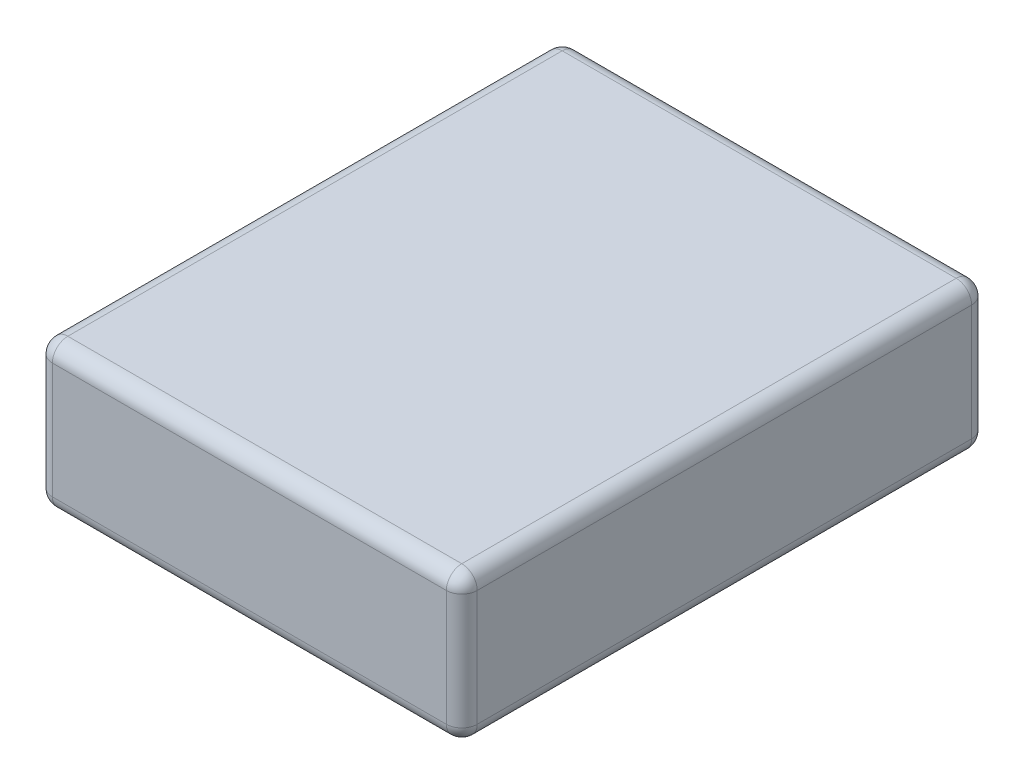
ISO-10303-21;
HEADER;
FILE_DESCRIPTION(('STEP AP214'),'2;1');
FILE_NAME('part.step','',(''),(''),'','','');
FILE_SCHEMA(('AUTOMOTIVE_DESIGN { 1 0 10303 214 1 1 1 1 }'));
ENDSEC;
DATA;
#1=APPLICATION_CONTEXT('core data for automotive mechanical design processes');
#2=APPLICATION_PROTOCOL_DEFINITION('international standard','automotive_design',2000,#1);
#3=PRODUCT_CONTEXT('',#1,'mechanical');
#4=PRODUCT('Part','Part','',(#3));
#5=PRODUCT_RELATED_PRODUCT_CATEGORY('part','',(#4));
#6=PRODUCT_DEFINITION_FORMATION('','',#4);
#7=PRODUCT_DEFINITION_CONTEXT('part definition',#1,'design');
#8=PRODUCT_DEFINITION('design','',#6,#7);
#9=PRODUCT_DEFINITION_SHAPE('','',#8);
#10=(LENGTH_UNIT() NAMED_UNIT(*) SI_UNIT(.MILLI.,.METRE.));
#11=(NAMED_UNIT(*) PLANE_ANGLE_UNIT() SI_UNIT($,.RADIAN.));
#12=(NAMED_UNIT(*) SI_UNIT($,.STERADIAN.) SOLID_ANGLE_UNIT());
#13=UNCERTAINTY_MEASURE_WITH_UNIT(LENGTH_MEASURE(1.E-05),#10,'distance_accuracy_value','');
#14=(GEOMETRIC_REPRESENTATION_CONTEXT(3) GLOBAL_UNCERTAINTY_ASSIGNED_CONTEXT((#13)) GLOBAL_UNIT_ASSIGNED_CONTEXT((#10,
#11,#12)) REPRESENTATION_CONTEXT('',''));
#15=CARTESIAN_POINT('',(0.,0.,0.));
#16=DIRECTION('',(0.,0.,1.));
#17=DIRECTION('',(1.,0.,0.));
#18=AXIS2_PLACEMENT_3D('',#15,#16,#17);
#19=CARTESIAN_POINT('',(-27.5,19.,34.));
#20=DIRECTION('',(1.,0.,0.));
#21=DIRECTION('',(0.,0.,-1.));
#22=AXIS2_PLACEMENT_3D('',#19,#20,#21);
#23=PLANE('',#22);
#24=DIRECTION('',(0.,-1.,0.));
#25=VECTOR('',#24,1.);
#26=CARTESIAN_POINT('',(-27.5,19.,32.));
#27=LINE('',#26,#25);
#28=CARTESIAN_POINT('',(-27.5,2.,32.));
#29=VERTEX_POINT('',#28);
#30=CARTESIAN_POINT('',(-27.5,17.,32.));
#31=VERTEX_POINT('',#30);
#32=EDGE_CURVE('E191',#29,#31,#27,.F.);
#33=ORIENTED_EDGE('',*,*,#32,.T.);
#34=DIRECTION('',(0.,0.,1.));
#35=VECTOR('',#34,1.);
#36=CARTESIAN_POINT('',(-27.5,17.,-34.));
#37=LINE('',#36,#35);
#38=CARTESIAN_POINT('',(-27.5,17.,-32.));
#39=VERTEX_POINT('',#38);
#40=EDGE_CURVE('E195',#31,#39,#37,.F.);
#41=ORIENTED_EDGE('',*,*,#40,.T.);
#42=DIRECTION('',(0.,-1.,0.));
#43=VECTOR('',#42,1.);
#44=CARTESIAN_POINT('',(-27.5,19.,-32.));
#45=LINE('',#44,#43);
#46=CARTESIAN_POINT('',(-27.5,2.,-32.));
#47=VERTEX_POINT('',#46);
#48=EDGE_CURVE('E188',#39,#47,#45,.T.);
#49=ORIENTED_EDGE('',*,*,#48,.T.);
#50=DIRECTION('',(0.,0.,1.));
#51=VECTOR('',#50,1.);
#52=CARTESIAN_POINT('',(-27.5,2.,34.));
#53=LINE('',#52,#51);
#54=EDGE_CURVE('E185',#47,#29,#53,.T.);
#55=ORIENTED_EDGE('',*,*,#54,.T.);
#56=EDGE_LOOP('',(#33,#41,#49,#55));
#57=FACE_BOUND('',#56,.T.);
#58=ADVANCED_FACE('F45',(#57),#23,.F.);
#59=CARTESIAN_POINT('',(27.5,19.,34.));
#60=DIRECTION('',(0.,0.,-1.));
#61=DIRECTION('',(-1.,0.,0.));
#62=AXIS2_PLACEMENT_3D('',#59,#60,#61);
#63=PLANE('',#62);
#64=DIRECTION('',(0.,-1.,0.));
#65=VECTOR('',#64,1.);
#66=CARTESIAN_POINT('',(-25.5,19.,34.));
#67=LINE('',#66,#65);
#68=CARTESIAN_POINT('',(-25.5,17.,34.));
#69=VERTEX_POINT('',#68);
#70=CARTESIAN_POINT('',(-25.5,2.,34.));
#71=VERTEX_POINT('',#70);
#72=EDGE_CURVE('E147',#69,#71,#67,.T.);
#73=ORIENTED_EDGE('',*,*,#72,.T.);
#74=DIRECTION('',(1.,0.,0.));
#75=VECTOR('',#74,1.);
#76=CARTESIAN_POINT('',(27.5,2.,34.));
#77=LINE('',#76,#75);
#78=CARTESIAN_POINT('',(25.5,2.,34.));
#79=VERTEX_POINT('',#78);
#80=EDGE_CURVE('E142',#71,#79,#77,.T.);
#81=ORIENTED_EDGE('',*,*,#80,.T.);
#82=DIRECTION('',(0.,-1.,0.));
#83=VECTOR('',#82,1.);
#84=CARTESIAN_POINT('',(25.5,19.,34.));
#85=LINE('',#84,#83);
#86=CARTESIAN_POINT('',(25.5,17.,34.));
#87=VERTEX_POINT('',#86);
#88=EDGE_CURVE('E134',#79,#87,#85,.F.);
#89=ORIENTED_EDGE('',*,*,#88,.T.);
#90=DIRECTION('',(1.,0.,0.));
#91=VECTOR('',#90,1.);
#92=CARTESIAN_POINT('',(-27.5,17.,34.));
#93=LINE('',#92,#91);
#94=EDGE_CURVE('E139',#87,#69,#93,.F.);
#95=ORIENTED_EDGE('',*,*,#94,.T.);
#96=EDGE_LOOP('',(#73,#81,#89,#95));
#97=FACE_BOUND('',#96,.T.);
#98=ADVANCED_FACE('F137',(#97),#63,.F.);
#99=CARTESIAN_POINT('',(27.5,19.,34.));
#100=DIRECTION('',(-1.,0.,0.));
#101=DIRECTION('',(0.,0.,1.));
#102=AXIS2_PLACEMENT_3D('',#99,#100,#101);
#103=PLANE('',#102);
#104=DIRECTION('',(0.,-1.,0.));
#105=VECTOR('',#104,1.);
#106=CARTESIAN_POINT('',(27.5,19.,32.));
#107=LINE('',#106,#105);
#108=CARTESIAN_POINT('',(27.5,17.,32.));
#109=VERTEX_POINT('',#108);
#110=CARTESIAN_POINT('',(27.5,2.,32.));
#111=VERTEX_POINT('',#110);
#112=EDGE_CURVE('E155',#109,#111,#107,.T.);
#113=ORIENTED_EDGE('',*,*,#112,.T.);
#114=DIRECTION('',(0.,0.,-1.));
#115=VECTOR('',#114,1.);
#116=CARTESIAN_POINT('',(27.5,2.,34.));
#117=LINE('',#116,#115);
#118=CARTESIAN_POINT('',(27.5,2.,-32.));
#119=VERTEX_POINT('',#118);
#120=EDGE_CURVE('E206',#111,#119,#117,.T.);
#121=ORIENTED_EDGE('',*,*,#120,.T.);
#122=DIRECTION('',(0.,-1.,0.));
#123=VECTOR('',#122,1.);
#124=CARTESIAN_POINT('',(27.5,19.,-32.));
#125=LINE('',#124,#123);
#126=CARTESIAN_POINT('',(27.5,17.,-32.));
#127=VERTEX_POINT('',#126);
#128=EDGE_CURVE('E201',#119,#127,#125,.F.);
#129=ORIENTED_EDGE('',*,*,#128,.T.);
#130=DIRECTION('',(0.,0.,-1.));
#131=VECTOR('',#130,1.);
#132=CARTESIAN_POINT('',(27.5,17.,34.));
#133=LINE('',#132,#131);
#134=EDGE_CURVE('E198',#127,#109,#133,.F.);
#135=ORIENTED_EDGE('',*,*,#134,.T.);
#136=EDGE_LOOP('',(#113,#121,#129,#135));
#137=FACE_BOUND('',#136,.T.);
#138=ADVANCED_FACE('F368',(#137),#103,.F.);
#139=CARTESIAN_POINT('',(27.5,19.,-34.));
#140=DIRECTION('',(0.,0.,1.));
#141=DIRECTION('',(1.,0.,0.));
#142=AXIS2_PLACEMENT_3D('',#139,#140,#141);
#143=PLANE('',#142);
#144=DIRECTION('',(0.,-1.,0.));
#145=VECTOR('',#144,1.);
#146=CARTESIAN_POINT('',(25.5,19.,-34.));
#147=LINE('',#146,#145);
#148=CARTESIAN_POINT('',(25.5,17.,-34.));
#149=VERTEX_POINT('',#148);
#150=CARTESIAN_POINT('',(25.5,2.,-34.));
#151=VERTEX_POINT('',#150);
#152=EDGE_CURVE('E212',#149,#151,#147,.T.);
#153=ORIENTED_EDGE('',*,*,#152,.T.);
#154=DIRECTION('',(-1.,0.,0.));
#155=VECTOR('',#154,1.);
#156=CARTESIAN_POINT('',(27.5,2.,-34.));
#157=LINE('',#156,#155);
#158=CARTESIAN_POINT('',(-25.5,2.,-34.));
#159=VERTEX_POINT('',#158);
#160=EDGE_CURVE('E219',#151,#159,#157,.T.);
#161=ORIENTED_EDGE('',*,*,#160,.T.);
#162=DIRECTION('',(0.,-1.,0.));
#163=VECTOR('',#162,1.);
#164=CARTESIAN_POINT('',(-25.5,19.,-34.));
#165=LINE('',#164,#163);
#166=CARTESIAN_POINT('',(-25.5,17.,-34.));
#167=VERTEX_POINT('',#166);
#168=EDGE_CURVE('E215',#159,#167,#165,.F.);
#169=ORIENTED_EDGE('',*,*,#168,.T.);
#170=DIRECTION('',(-1.,0.,0.));
#171=VECTOR('',#170,1.);
#172=CARTESIAN_POINT('',(27.5,17.,-34.));
#173=LINE('',#172,#171);
#174=EDGE_CURVE('E209',#167,#149,#173,.F.);
#175=ORIENTED_EDGE('',*,*,#174,.T.);
#176=EDGE_LOOP('',(#153,#161,#169,#175));
#177=FACE_BOUND('',#176,.T.);
#178=ADVANCED_FACE('F352',(#177),#143,.F.);
#179=CARTESIAN_POINT('',(0.,19.,0.));
#180=DIRECTION('',(0.,1.,0.));
#181=DIRECTION('',(0.,0.,1.));
#182=AXIS2_PLACEMENT_3D('',#179,#180,#181);
#183=PLANE('',#182);
#184=DIRECTION('',(-1.,0.,0.));
#185=VECTOR('',#184,1.);
#186=CARTESIAN_POINT('',(-27.5,19.,-32.));
#187=LINE('',#186,#185);
#188=CARTESIAN_POINT('',(25.5,19.,-32.));
#189=VERTEX_POINT('',#188);
#190=CARTESIAN_POINT('',(-25.5,19.,-32.));
#191=VERTEX_POINT('',#190);
#192=EDGE_CURVE('E55',#189,#191,#187,.T.);
#193=ORIENTED_EDGE('',*,*,#192,.T.);
#194=DIRECTION('',(0.,0.,1.));
#195=VECTOR('',#194,1.);
#196=CARTESIAN_POINT('',(-25.5,19.,34.));
#197=LINE('',#196,#195);
#198=CARTESIAN_POINT('',(-25.5,19.,32.));
#199=VERTEX_POINT('',#198);
#200=EDGE_CURVE('E11',#191,#199,#197,.T.);
#201=ORIENTED_EDGE('',*,*,#200,.T.);
#202=DIRECTION('',(1.,0.,0.));
#203=VECTOR('',#202,1.);
#204=CARTESIAN_POINT('',(27.5,19.,32.));
#205=LINE('',#204,#203);
#206=CARTESIAN_POINT('',(25.5,19.,32.));
#207=VERTEX_POINT('',#206);
#208=EDGE_CURVE('E238',#199,#207,#205,.T.);
#209=ORIENTED_EDGE('',*,*,#208,.T.);
#210=DIRECTION('',(0.,0.,-1.));
#211=VECTOR('',#210,1.);
#212=CARTESIAN_POINT('',(25.5,19.,-34.));
#213=LINE('',#212,#211);
#214=EDGE_CURVE('E235',#207,#189,#213,.T.);
#215=ORIENTED_EDGE('',*,*,#214,.T.);
#216=EDGE_LOOP('',(#193,#201,#209,#215));
#217=FACE_BOUND('',#216,.T.);
#218=ADVANCED_FACE('F363',(#217),#183,.T.);
#219=CARTESIAN_POINT('',(0.,0.,0.));
#220=DIRECTION('',(0.,1.,0.));
#221=DIRECTION('',(0.,0.,1.));
#222=AXIS2_PLACEMENT_3D('',#219,#220,#221);
#223=PLANE('',#222);
#224=DIRECTION('',(1.,0.,0.));
#225=VECTOR('',#224,1.);
#226=CARTESIAN_POINT('',(0.,0.,32.));
#227=LINE('',#226,#225);
#228=CARTESIAN_POINT('',(25.5,0.,32.));
#229=VERTEX_POINT('',#228);
#230=CARTESIAN_POINT('',(-25.5,0.,32.));
#231=VERTEX_POINT('',#230);
#232=EDGE_CURVE('E225',#229,#231,#227,.F.);
#233=ORIENTED_EDGE('',*,*,#232,.T.);
#234=DIRECTION('',(0.,0.,1.));
#235=VECTOR('',#234,1.);
#236=CARTESIAN_POINT('',(-25.5,0.,0.));
#237=LINE('',#236,#235);
#238=CARTESIAN_POINT('',(-25.5,0.,-32.));
#239=VERTEX_POINT('',#238);
#240=EDGE_CURVE('E232',#231,#239,#237,.F.);
#241=ORIENTED_EDGE('',*,*,#240,.T.);
#242=DIRECTION('',(-1.,0.,0.));
#243=VECTOR('',#242,1.);
#244=CARTESIAN_POINT('',(0.,0.,-32.));
#245=LINE('',#244,#243);
#246=CARTESIAN_POINT('',(25.5,0.,-32.));
#247=VERTEX_POINT('',#246);
#248=EDGE_CURVE('E228',#239,#247,#245,.F.);
#249=ORIENTED_EDGE('',*,*,#248,.T.);
#250=DIRECTION('',(0.,0.,-1.));
#251=VECTOR('',#250,1.);
#252=CARTESIAN_POINT('',(25.5,0.,0.));
#253=LINE('',#252,#251);
#254=EDGE_CURVE('E222',#247,#229,#253,.F.);
#255=ORIENTED_EDGE('',*,*,#254,.T.);
#256=EDGE_LOOP('',(#233,#241,#249,#255));
#257=FACE_BOUND('',#256,.T.);
#258=ADVANCED_FACE('F326',(#257),#223,.F.);
#259=CARTESIAN_POINT('',(25.5,19.,-32.));
#260=DIRECTION('',(0.,-1.,0.));
#261=DIRECTION('',(0.,0.,-1.));
#262=AXIS2_PLACEMENT_3D('',#259,#260,#261);
#263=CYLINDRICAL_SURFACE('',#262,2.);
#264=CARTESIAN_POINT('',(25.5,17.,-32.));
#265=DIRECTION('',(0.,1.,0.));
#266=DIRECTION('',(0.,0.,1.));
#267=AXIS2_PLACEMENT_3D('',#264,#265,#266);
#268=CIRCLE('',#267,2.);
#269=EDGE_CURVE('E49',#127,#149,#268,.T.);
#270=ORIENTED_EDGE('',*,*,#269,.F.);
#271=ORIENTED_EDGE('',*,*,#128,.F.);
#272=CARTESIAN_POINT('',(25.5,2.,-32.));
#273=DIRECTION('',(0.,-1.,0.));
#274=DIRECTION('',(0.,0.,-1.));
#275=AXIS2_PLACEMENT_3D('',#272,#273,#274);
#276=CIRCLE('',#275,2.);
#277=EDGE_CURVE('E179',#151,#119,#276,.T.);
#278=ORIENTED_EDGE('',*,*,#277,.F.);
#279=ORIENTED_EDGE('',*,*,#152,.F.);
#280=EDGE_LOOP('',(#270,#271,#278,#279));
#281=FACE_BOUND('',#280,.T.);
#282=ADVANCED_FACE('F47',(#281),#263,.T.);
#283=CARTESIAN_POINT('',(25.5,17.,-32.));
#284=DIRECTION('',(0.,0.,-1.));
#285=DIRECTION('',(-1.,0.,0.));
#286=AXIS2_PLACEMENT_3D('',#283,#284,#285);
#287=SPHERICAL_SURFACE('',#286,2.);
#288=CARTESIAN_POINT('',(25.5,17.,-32.));
#289=DIRECTION('',(0.,0.,-1.));
#290=DIRECTION('',(-1.,0.,0.));
#291=AXIS2_PLACEMENT_3D('',#288,#289,#290);
#292=CIRCLE('',#291,2.);
#293=EDGE_CURVE('E302',#127,#189,#292,.F.);
#294=ORIENTED_EDGE('',*,*,#293,.F.);
#295=ORIENTED_EDGE('',*,*,#269,.T.);
#296=CARTESIAN_POINT('',(25.5,17.,-32.));
#297=DIRECTION('',(1.,0.,0.));
#298=DIRECTION('',(0.,0.,-1.));
#299=AXIS2_PLACEMENT_3D('',#296,#297,#298);
#300=CIRCLE('',#299,2.);
#301=EDGE_CURVE('E306',#189,#149,#300,.F.);
#302=ORIENTED_EDGE('',*,*,#301,.F.);
#303=EDGE_LOOP('',(#294,#295,#302));
#304=FACE_BOUND('',#303,.T.);
#305=ADVANCED_FACE('F357',(#304),#287,.T.);
#306=CARTESIAN_POINT('',(25.5,2.,-32.));
#307=DIRECTION('',(1.,0.,0.));
#308=DIRECTION('',(0.,1.,0.));
#309=AXIS2_PLACEMENT_3D('',#306,#307,#308);
#310=SPHERICAL_SURFACE('',#309,2.);
#311=CARTESIAN_POINT('',(25.5,2.,-32.));
#312=DIRECTION('',(1.,0.,0.));
#313=DIRECTION('',(0.,0.,-1.));
#314=AXIS2_PLACEMENT_3D('',#311,#312,#313);
#315=CIRCLE('',#314,2.);
#316=EDGE_CURVE('E294',#151,#247,#315,.F.);
#317=ORIENTED_EDGE('',*,*,#316,.F.);
#318=ORIENTED_EDGE('',*,*,#277,.T.);
#319=CARTESIAN_POINT('',(25.5,2.,-32.));
#320=DIRECTION('',(0.,0.,-1.));
#321=DIRECTION('',(-1.,0.,0.));
#322=AXIS2_PLACEMENT_3D('',#319,#320,#321);
#323=CIRCLE('',#322,2.);
#324=EDGE_CURVE('E298',#247,#119,#323,.F.);
#325=ORIENTED_EDGE('',*,*,#324,.F.);
#326=EDGE_LOOP('',(#317,#318,#325));
#327=FACE_BOUND('',#326,.T.);
#328=ADVANCED_FACE('F315',(#327),#310,.T.);
#329=CARTESIAN_POINT('',(0.,17.,-32.));
#330=DIRECTION('',(1.,0.,0.));
#331=DIRECTION('',(0.,0.,-1.));
#332=AXIS2_PLACEMENT_3D('',#329,#330,#331);
#333=CYLINDRICAL_SURFACE('',#332,2.);
#334=ORIENTED_EDGE('',*,*,#301,.T.);
#335=ORIENTED_EDGE('',*,*,#174,.F.);
#336=CARTESIAN_POINT('',(-25.5,17.,-32.));
#337=DIRECTION('',(-1.,0.,0.));
#338=DIRECTION('',(0.,0.,1.));
#339=AXIS2_PLACEMENT_3D('',#336,#337,#338);
#340=CIRCLE('',#339,2.);
#341=EDGE_CURVE('E287',#191,#167,#340,.T.);
#342=ORIENTED_EDGE('',*,*,#341,.F.);
#343=ORIENTED_EDGE('',*,*,#192,.F.);
#344=EDGE_LOOP('',(#334,#335,#342,#343));
#345=FACE_BOUND('',#344,.T.);
#346=ADVANCED_FACE('F361',(#345),#333,.T.);
#347=CARTESIAN_POINT('',(25.5,17.,0.));
#348=DIRECTION('',(0.,0.,1.));
#349=DIRECTION('',(1.,0.,0.));
#350=AXIS2_PLACEMENT_3D('',#347,#348,#349);
#351=CYLINDRICAL_SURFACE('',#350,2.);
#352=ORIENTED_EDGE('',*,*,#293,.T.);
#353=ORIENTED_EDGE('',*,*,#214,.F.);
#354=CARTESIAN_POINT('',(25.5,17.,32.));
#355=DIRECTION('',(0.,0.,1.));
#356=DIRECTION('',(1.,0.,0.));
#357=AXIS2_PLACEMENT_3D('',#354,#355,#356);
#358=CIRCLE('',#357,2.);
#359=EDGE_CURVE('E160',#109,#207,#358,.T.);
#360=ORIENTED_EDGE('',*,*,#359,.F.);
#361=ORIENTED_EDGE('',*,*,#134,.F.);
#362=EDGE_LOOP('',(#352,#353,#360,#361));
#363=FACE_BOUND('',#362,.T.);
#364=ADVANCED_FACE('F366',(#363),#351,.T.);
#365=CARTESIAN_POINT('',(25.5,19.,32.));
#366=DIRECTION('',(0.,-1.,0.));
#367=DIRECTION('',(0.,0.,-1.));
#368=AXIS2_PLACEMENT_3D('',#365,#366,#367);
#369=CYLINDRICAL_SURFACE('',#368,2.);
#370=CARTESIAN_POINT('',(25.5,2.,32.));
#371=DIRECTION('',(0.,-1.,0.));
#372=DIRECTION('',(0.,0.,-1.));
#373=AXIS2_PLACEMENT_3D('',#370,#371,#372);
#374=CIRCLE('',#373,2.);
#375=EDGE_CURVE('E161',#111,#79,#374,.T.);
#376=ORIENTED_EDGE('',*,*,#375,.F.);
#377=ORIENTED_EDGE('',*,*,#112,.F.);
#378=CARTESIAN_POINT('',(25.5,17.,32.));
#379=DIRECTION('',(0.,1.,0.));
#380=DIRECTION('',(0.,0.,1.));
#381=AXIS2_PLACEMENT_3D('',#378,#379,#380);
#382=CIRCLE('',#381,2.);
#383=EDGE_CURVE('E151',#87,#109,#382,.T.);
#384=ORIENTED_EDGE('',*,*,#383,.F.);
#385=ORIENTED_EDGE('',*,*,#88,.F.);
#386=EDGE_LOOP('',(#376,#377,#384,#385));
#387=FACE_BOUND('',#386,.T.);
#388=ADVANCED_FACE('F153',(#387),#369,.T.);
#389=CARTESIAN_POINT('',(25.5,2.,34.));
#390=DIRECTION('',(0.,0.,-1.));
#391=DIRECTION('',(-1.,0.,0.));
#392=AXIS2_PLACEMENT_3D('',#389,#390,#391);
#393=CYLINDRICAL_SURFACE('',#392,2.);
#394=ORIENTED_EDGE('',*,*,#324,.T.);
#395=ORIENTED_EDGE('',*,*,#120,.F.);
#396=CARTESIAN_POINT('',(25.5,2.,32.));
#397=DIRECTION('',(0.,0.,1.));
#398=DIRECTION('',(1.,0.,0.));
#399=AXIS2_PLACEMENT_3D('',#396,#397,#398);
#400=CIRCLE('',#399,2.);
#401=EDGE_CURVE('E280',#229,#111,#400,.T.);
#402=ORIENTED_EDGE('',*,*,#401,.F.);
#403=ORIENTED_EDGE('',*,*,#254,.F.);
#404=EDGE_LOOP('',(#394,#395,#402,#403));
#405=FACE_BOUND('',#404,.T.);
#406=ADVANCED_FACE('F322',(#405),#393,.T.);
#407=CARTESIAN_POINT('',(27.5,2.,-32.));
#408=DIRECTION('',(-1.,0.,0.));
#409=DIRECTION('',(0.,0.,1.));
#410=AXIS2_PLACEMENT_3D('',#407,#408,#409);
#411=CYLINDRICAL_SURFACE('',#410,2.);
#412=ORIENTED_EDGE('',*,*,#316,.T.);
#413=ORIENTED_EDGE('',*,*,#248,.F.);
#414=CARTESIAN_POINT('',(-25.5,2.,-32.));
#415=DIRECTION('',(-1.,0.,0.));
#416=DIRECTION('',(0.,0.,1.));
#417=AXIS2_PLACEMENT_3D('',#414,#415,#416);
#418=CIRCLE('',#417,2.);
#419=EDGE_CURVE('E276',#159,#239,#418,.T.);
#420=ORIENTED_EDGE('',*,*,#419,.F.);
#421=ORIENTED_EDGE('',*,*,#160,.F.);
#422=EDGE_LOOP('',(#412,#413,#420,#421));
#423=FACE_BOUND('',#422,.T.);
#424=ADVANCED_FACE('F332',(#423),#411,.T.);
#425=CARTESIAN_POINT('',(-25.5,19.,-32.));
#426=DIRECTION('',(0.,-1.,0.));
#427=DIRECTION('',(0.,0.,-1.));
#428=AXIS2_PLACEMENT_3D('',#425,#426,#427);
#429=CYLINDRICAL_SURFACE('',#428,2.);
#430=CARTESIAN_POINT('',(-25.5,17.,-32.));
#431=DIRECTION('',(0.,1.,0.));
#432=DIRECTION('',(0.,0.,1.));
#433=AXIS2_PLACEMENT_3D('',#430,#431,#432);
#434=CIRCLE('',#433,2.);
#435=EDGE_CURVE('E290',#167,#39,#434,.T.);
#436=ORIENTED_EDGE('',*,*,#435,.F.);
#437=ORIENTED_EDGE('',*,*,#168,.F.);
#438=CARTESIAN_POINT('',(-25.5,2.,-32.));
#439=DIRECTION('',(0.,-1.,0.));
#440=DIRECTION('',(0.,0.,-1.));
#441=AXIS2_PLACEMENT_3D('',#438,#439,#440);
#442=CIRCLE('',#441,2.);
#443=EDGE_CURVE('E272',#47,#159,#442,.T.);
#444=ORIENTED_EDGE('',*,*,#443,.F.);
#445=ORIENTED_EDGE('',*,*,#48,.F.);
#446=EDGE_LOOP('',(#436,#437,#444,#445));
#447=FACE_BOUND('',#446,.T.);
#448=ADVANCED_FACE('F349',(#447),#429,.T.);
#449=CARTESIAN_POINT('',(-25.5,17.,-32.));
#450=DIRECTION('',(0.,0.,-1.));
#451=DIRECTION('',(-1.,0.,0.));
#452=AXIS2_PLACEMENT_3D('',#449,#450,#451);
#453=SPHERICAL_SURFACE('',#452,2.);
#454=ORIENTED_EDGE('',*,*,#341,.T.);
#455=ORIENTED_EDGE('',*,*,#435,.T.);
#456=CARTESIAN_POINT('',(-25.5,17.,-32.));
#457=DIRECTION('',(0.,0.,-1.));
#458=DIRECTION('',(0.,1.,0.));
#459=AXIS2_PLACEMENT_3D('',#456,#457,#458);
#460=CIRCLE('',#459,2.);
#461=EDGE_CURVE('E168',#191,#39,#460,.F.);
#462=ORIENTED_EDGE('',*,*,#461,.F.);
#463=EDGE_LOOP('',(#454,#455,#462));
#464=FACE_BOUND('',#463,.T.);
#465=ADVANCED_FACE('F413',(#464),#453,.T.);
#466=CARTESIAN_POINT('',(25.5,17.,32.));
#467=DIRECTION('',(1.,0.,0.));
#468=DIRECTION('',(0.,0.,-1.));
#469=AXIS2_PLACEMENT_3D('',#466,#467,#468);
#470=SPHERICAL_SURFACE('',#469,2.);
#471=ORIENTED_EDGE('',*,*,#383,.T.);
#472=ORIENTED_EDGE('',*,*,#359,.T.);
#473=CARTESIAN_POINT('',(25.5,17.,32.));
#474=DIRECTION('',(1.,0.,0.));
#475=DIRECTION('',(0.,0.,-1.));
#476=AXIS2_PLACEMENT_3D('',#473,#474,#475);
#477=CIRCLE('',#476,2.);
#478=EDGE_CURVE('E164',#87,#207,#477,.F.);
#479=ORIENTED_EDGE('',*,*,#478,.F.);
#480=EDGE_LOOP('',(#471,#472,#479));
#481=FACE_BOUND('',#480,.T.);
#482=ADVANCED_FACE('F165',(#481),#470,.T.);
#483=CARTESIAN_POINT('',(25.5,2.,32.));
#484=DIRECTION('',(1.,0.,0.));
#485=DIRECTION('',(0.,1.,0.));
#486=AXIS2_PLACEMENT_3D('',#483,#484,#485);
#487=SPHERICAL_SURFACE('',#486,2.);
#488=ORIENTED_EDGE('',*,*,#401,.T.);
#489=ORIENTED_EDGE('',*,*,#375,.T.);
#490=CARTESIAN_POINT('',(25.5,2.,32.));
#491=DIRECTION('',(1.,0.,0.));
#492=DIRECTION('',(0.,0.,-1.));
#493=AXIS2_PLACEMENT_3D('',#490,#491,#492);
#494=CIRCLE('',#493,2.);
#495=EDGE_CURVE('E169',#229,#79,#494,.F.);
#496=ORIENTED_EDGE('',*,*,#495,.F.);
#497=EDGE_LOOP('',(#488,#489,#496));
#498=FACE_BOUND('',#497,.T.);
#499=ADVANCED_FACE('F407',(#498),#487,.T.);
#500=CARTESIAN_POINT('',(-25.5,2.,-32.));
#501=DIRECTION('',(0.,0.,-1.));
#502=DIRECTION('',(0.,1.,0.));
#503=AXIS2_PLACEMENT_3D('',#500,#501,#502);
#504=SPHERICAL_SURFACE('',#503,2.);
#505=ORIENTED_EDGE('',*,*,#443,.T.);
#506=ORIENTED_EDGE('',*,*,#419,.T.);
#507=CARTESIAN_POINT('',(-25.5,2.,-32.));
#508=DIRECTION('',(0.,0.,-1.));
#509=DIRECTION('',(-1.,0.,0.));
#510=AXIS2_PLACEMENT_3D('',#507,#508,#509);
#511=CIRCLE('',#510,2.);
#512=EDGE_CURVE('E263',#47,#239,#511,.F.);
#513=ORIENTED_EDGE('',*,*,#512,.F.);
#514=EDGE_LOOP('',(#505,#506,#513));
#515=FACE_BOUND('',#514,.T.);
#516=ADVANCED_FACE('F335',(#515),#504,.T.);
#517=CARTESIAN_POINT('',(-25.5,17.,0.));
#518=DIRECTION('',(0.,0.,-1.));
#519=DIRECTION('',(-1.,0.,0.));
#520=AXIS2_PLACEMENT_3D('',#517,#518,#519);
#521=CYLINDRICAL_SURFACE('',#520,2.);
#522=ORIENTED_EDGE('',*,*,#461,.T.);
#523=ORIENTED_EDGE('',*,*,#40,.F.);
#524=CARTESIAN_POINT('',(-25.5,17.,32.));
#525=DIRECTION('',(0.,0.,1.));
#526=DIRECTION('',(1.,0.,0.));
#527=AXIS2_PLACEMENT_3D('',#524,#525,#526);
#528=CIRCLE('',#527,2.);
#529=EDGE_CURVE('E259',#199,#31,#528,.T.);
#530=ORIENTED_EDGE('',*,*,#529,.F.);
#531=ORIENTED_EDGE('',*,*,#200,.F.);
#532=EDGE_LOOP('',(#522,#523,#530,#531));
#533=FACE_BOUND('',#532,.T.);
#534=ADVANCED_FACE('F402',(#533),#521,.T.);
#535=CARTESIAN_POINT('',(0.,17.,32.));
#536=DIRECTION('',(-1.,0.,0.));
#537=DIRECTION('',(0.,0.,1.));
#538=AXIS2_PLACEMENT_3D('',#535,#536,#537);
#539=CYLINDRICAL_SURFACE('',#538,2.);
#540=ORIENTED_EDGE('',*,*,#478,.T.);
#541=ORIENTED_EDGE('',*,*,#208,.F.);
#542=CARTESIAN_POINT('',(-25.5,17.,32.));
#543=DIRECTION('',(-1.,0.,0.));
#544=DIRECTION('',(0.,-1.,0.));
#545=AXIS2_PLACEMENT_3D('',#542,#543,#544);
#546=CIRCLE('',#545,2.);
#547=EDGE_CURVE('E173',#69,#199,#546,.T.);
#548=ORIENTED_EDGE('',*,*,#547,.F.);
#549=ORIENTED_EDGE('',*,*,#94,.F.);
#550=EDGE_LOOP('',(#540,#541,#548,#549));
#551=FACE_BOUND('',#550,.T.);
#552=ADVANCED_FACE('F171',(#551),#539,.T.);
#553=CARTESIAN_POINT('',(27.5,2.,32.));
#554=DIRECTION('',(1.,0.,0.));
#555=DIRECTION('',(0.,0.,-1.));
#556=AXIS2_PLACEMENT_3D('',#553,#554,#555);
#557=CYLINDRICAL_SURFACE('',#556,2.);
#558=ORIENTED_EDGE('',*,*,#495,.T.);
#559=ORIENTED_EDGE('',*,*,#80,.F.);
#560=CARTESIAN_POINT('',(-25.5,2.,32.));
#561=DIRECTION('',(-1.,0.,0.));
#562=DIRECTION('',(0.,0.,1.));
#563=AXIS2_PLACEMENT_3D('',#560,#561,#562);
#564=CIRCLE('',#563,2.);
#565=EDGE_CURVE('E253',#231,#71,#564,.T.);
#566=ORIENTED_EDGE('',*,*,#565,.F.);
#567=ORIENTED_EDGE('',*,*,#232,.F.);
#568=EDGE_LOOP('',(#558,#559,#566,#567));
#569=FACE_BOUND('',#568,.T.);
#570=ADVANCED_FACE('F396',(#569),#557,.T.);
#571=CARTESIAN_POINT('',(-25.5,2.,34.));
#572=DIRECTION('',(0.,0.,1.));
#573=DIRECTION('',(1.,0.,0.));
#574=AXIS2_PLACEMENT_3D('',#571,#572,#573);
#575=CYLINDRICAL_SURFACE('',#574,2.);
#576=ORIENTED_EDGE('',*,*,#512,.T.);
#577=ORIENTED_EDGE('',*,*,#240,.F.);
#578=CARTESIAN_POINT('',(-25.5,2.,32.));
#579=DIRECTION('',(0.,0.,1.));
#580=DIRECTION('',(1.,0.,0.));
#581=AXIS2_PLACEMENT_3D('',#578,#579,#580);
#582=CIRCLE('',#581,2.);
#583=EDGE_CURVE('E249',#29,#231,#582,.T.);
#584=ORIENTED_EDGE('',*,*,#583,.F.);
#585=ORIENTED_EDGE('',*,*,#54,.F.);
#586=EDGE_LOOP('',(#576,#577,#584,#585));
#587=FACE_BOUND('',#586,.T.);
#588=ADVANCED_FACE('F339',(#587),#575,.T.);
#589=CARTESIAN_POINT('',(-25.5,17.,32.));
#590=DIRECTION('',(0.,1.,0.));
#591=DIRECTION('',(0.,0.,1.));
#592=AXIS2_PLACEMENT_3D('',#589,#590,#591);
#593=SPHERICAL_SURFACE('',#592,2.);
#594=ORIENTED_EDGE('',*,*,#547,.T.);
#595=ORIENTED_EDGE('',*,*,#529,.T.);
#596=CARTESIAN_POINT('',(-25.5,17.,32.));
#597=DIRECTION('',(0.,1.,0.));
#598=DIRECTION('',(0.,0.,1.));
#599=AXIS2_PLACEMENT_3D('',#596,#597,#598);
#600=CIRCLE('',#599,2.);
#601=EDGE_CURVE('E246',#69,#31,#600,.F.);
#602=ORIENTED_EDGE('',*,*,#601,.F.);
#603=EDGE_LOOP('',(#594,#595,#602));
#604=FACE_BOUND('',#603,.T.);
#605=ADVANCED_FACE('F389',(#604),#593,.T.);
#606=CARTESIAN_POINT('',(-25.5,2.,32.));
#607=DIRECTION('',(0.,-1.,0.));
#608=DIRECTION('',(0.,0.,-1.));
#609=AXIS2_PLACEMENT_3D('',#606,#607,#608);
#610=SPHERICAL_SURFACE('',#609,2.);
#611=ORIENTED_EDGE('',*,*,#583,.T.);
#612=ORIENTED_EDGE('',*,*,#565,.T.);
#613=CARTESIAN_POINT('',(-25.5,2.,32.));
#614=DIRECTION('',(0.,-1.,0.));
#615=DIRECTION('',(0.,0.,-1.));
#616=AXIS2_PLACEMENT_3D('',#613,#614,#615);
#617=CIRCLE('',#616,2.);
#618=EDGE_CURVE('E243',#29,#71,#617,.F.);
#619=ORIENTED_EDGE('',*,*,#618,.F.);
#620=EDGE_LOOP('',(#611,#612,#619));
#621=FACE_BOUND('',#620,.T.);
#622=ADVANCED_FACE('F385',(#621),#610,.T.);
#623=CARTESIAN_POINT('',(-25.5,19.,32.));
#624=DIRECTION('',(0.,-1.,0.));
#625=DIRECTION('',(0.,0.,-1.));
#626=AXIS2_PLACEMENT_3D('',#623,#624,#625);
#627=CYLINDRICAL_SURFACE('',#626,2.);
#628=ORIENTED_EDGE('',*,*,#601,.T.);
#629=ORIENTED_EDGE('',*,*,#32,.F.);
#630=ORIENTED_EDGE('',*,*,#618,.T.);
#631=ORIENTED_EDGE('',*,*,#72,.F.);
#632=EDGE_LOOP('',(#628,#629,#630,#631));
#633=FACE_BOUND('',#632,.T.);
#634=ADVANCED_FACE('F382',(#633),#627,.T.);
#635=CLOSED_SHELL('',(#58,#98,#138,#178,#218,#258,#282,#305,#328,#346,#364,#388,#406,#424,#448,
#465,#482,#499,#516,#534,#552,#570,#588,#605,#622,#634));
#636=MANIFOLD_SOLID_BREP('B2',#635);
#637=ADVANCED_BREP_SHAPE_REPRESENTATION('',(#18,#636),#14);
#638=SHAPE_DEFINITION_REPRESENTATION(#9,#637);
ENDSEC;
END-ISO-10303-21;
